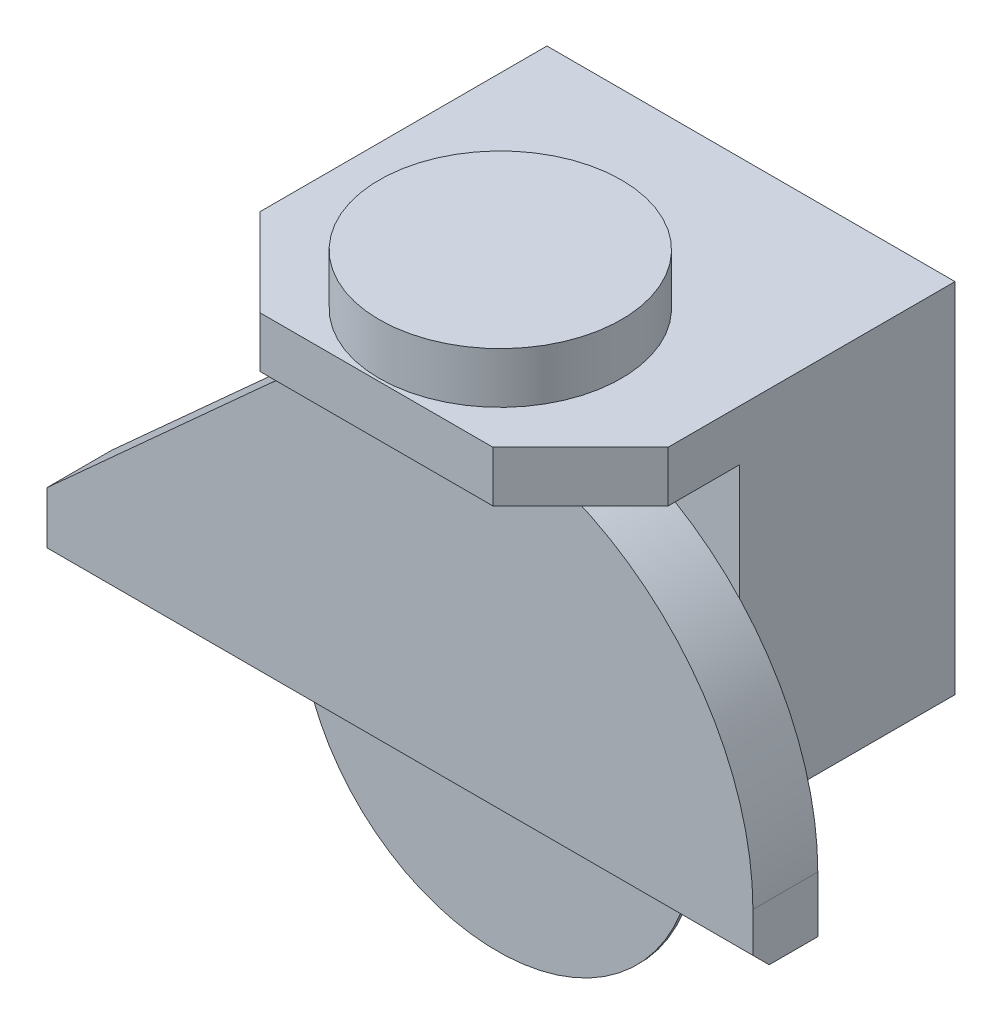
ISO-10303-21;
HEADER;
FILE_DESCRIPTION(('STEP AP214'),'2;1');
FILE_NAME('part.step','',(''),(''),'','','');
FILE_SCHEMA(('AUTOMOTIVE_DESIGN { 1 0 10303 214 1 1 1 1 }'));
ENDSEC;
DATA;
#1=APPLICATION_CONTEXT('core data for automotive mechanical design processes');
#2=APPLICATION_PROTOCOL_DEFINITION('international standard','automotive_design',2000,#1);
#3=PRODUCT_CONTEXT('',#1,'mechanical');
#4=PRODUCT('Part','Part','',(#3));
#5=PRODUCT_RELATED_PRODUCT_CATEGORY('part','',(#4));
#6=PRODUCT_DEFINITION_FORMATION('','',#4);
#7=PRODUCT_DEFINITION_CONTEXT('part definition',#1,'design');
#8=PRODUCT_DEFINITION('design','',#6,#7);
#9=PRODUCT_DEFINITION_SHAPE('','',#8);
#10=(LENGTH_UNIT() NAMED_UNIT(*) SI_UNIT(.MILLI.,.METRE.));
#11=(NAMED_UNIT(*) PLANE_ANGLE_UNIT() SI_UNIT($,.RADIAN.));
#12=(NAMED_UNIT(*) SI_UNIT($,.STERADIAN.) SOLID_ANGLE_UNIT());
#13=UNCERTAINTY_MEASURE_WITH_UNIT(LENGTH_MEASURE(1.E-05),#10,'distance_accuracy_value','');
#14=(GEOMETRIC_REPRESENTATION_CONTEXT(3) GLOBAL_UNCERTAINTY_ASSIGNED_CONTEXT((#13)) GLOBAL_UNIT_ASSIGNED_CONTEXT((#10,
#11,#12)) REPRESENTATION_CONTEXT('',''));
#15=CARTESIAN_POINT('',(0.,0.,0.));
#16=DIRECTION('',(0.,0.,1.));
#17=DIRECTION('',(1.,0.,0.));
#18=AXIS2_PLACEMENT_3D('',#15,#16,#17);
#19=CARTESIAN_POINT('',(0.,0.,-350.));
#20=DIRECTION('',(0.,0.,1.));
#21=DIRECTION('',(1.,0.,0.));
#22=AXIS2_PLACEMENT_3D('',#19,#20,#21);
#23=CYLINDRICAL_SURFACE('',#22,105.863842180841);
#24=CARTESIAN_POINT('',(0.,0.,-32.4999999999999));
#25=DIRECTION('',(0.,0.,1.));
#26=DIRECTION('',(1.,0.,0.));
#27=AXIS2_PLACEMENT_3D('',#24,#25,#26);
#28=CIRCLE('',#27,105.863842180841);
#29=CARTESIAN_POINT('',(84.3798817403787,-63.9311241788353,-32.4999999999999));
#30=VERTEX_POINT('',#29);
#31=CARTESIAN_POINT('',(-84.3798817403787,-63.9311241788353,-32.4999999999999));
#32=VERTEX_POINT('',#31);
#33=EDGE_CURVE('E313',#30,#32,#28,.T.);
#34=ORIENTED_EDGE('',*,*,#33,.F.);
#35=DIRECTION('',(0.,0.,1.));
#36=VECTOR('',#35,1.);
#37=CARTESIAN_POINT('',(84.3798817403787,-63.9311241788353,-350.));
#38=LINE('',#37,#36);
#39=CARTESIAN_POINT('',(84.3798817403787,-63.9311241788353,0.));
#40=VERTEX_POINT('',#39);
#41=EDGE_CURVE('E250',#30,#40,#38,.T.);
#42=ORIENTED_EDGE('',*,*,#41,.T.);
#43=CARTESIAN_POINT('',(0.,0.,0.));
#44=DIRECTION('',(0.,0.,-1.));
#45=DIRECTION('',(-1.,0.,0.));
#46=AXIS2_PLACEMENT_3D('',#43,#44,#45);
#47=CIRCLE('',#46,105.863842180841);
#48=CARTESIAN_POINT('',(-84.3798817403787,-63.9311241788353,0.));
#49=VERTEX_POINT('',#48);
#50=EDGE_CURVE('E291',#40,#49,#47,.T.);
#51=ORIENTED_EDGE('',*,*,#50,.T.);
#52=DIRECTION('',(0.,0.,1.));
#53=VECTOR('',#52,1.);
#54=CARTESIAN_POINT('',(-84.3798817403787,-63.9311241788353,-350.));
#55=LINE('',#54,#53);
#56=EDGE_CURVE('E258',#49,#32,#55,.F.);
#57=ORIENTED_EDGE('',*,*,#56,.T.);
#58=EDGE_LOOP('',(#34,#42,#51,#57));
#59=FACE_BOUND('',#58,.T.);
#60=CARTESIAN_POINT('',(0.,0.,-350.));
#61=DIRECTION('',(0.,0.,-1.));
#62=DIRECTION('',(-1.,0.,0.));
#63=AXIS2_PLACEMENT_3D('',#60,#61,#62);
#64=CIRCLE('',#63,105.863842180841);
#65=CARTESIAN_POINT('',(-105.863842180841,0.,-350.));
#66=VERTEX_POINT('',#65);
#67=EDGE_CURVE('E287',#66,#66,#64,.T.);
#68=ORIENTED_EDGE('',*,*,#67,.F.);
#69=EDGE_LOOP('',(#68));
#70=FACE_BOUND('',#69,.T.);
#71=DIRECTION('',(0.,0.,1.));
#72=VECTOR('',#71,1.);
#73=CARTESIAN_POINT('',(-105.863842180841,0.,-350.));
#74=LINE('',#73,#72);
#75=CARTESIAN_POINT('',(-105.863842180841,0.,-285.873317537533));
#76=VERTEX_POINT('',#75);
#77=CARTESIAN_POINT('',(-105.863842180841,0.,-39.836858515765));
#78=VERTEX_POINT('',#77);
#79=EDGE_CURVE('E308',#76,#78,#74,.T.);
#80=ORIENTED_EDGE('',*,*,#79,.F.);
#81=CARTESIAN_POINT('',(0.,0.,-285.873317537533));
#82=DIRECTION('',(0.,0.,1.));
#83=DIRECTION('',(1.,0.,0.));
#84=AXIS2_PLACEMENT_3D('',#81,#82,#83);
#85=CIRCLE('',#84,105.863842180841);
#86=CARTESIAN_POINT('',(105.863842180841,0.,-285.873317537533));
#87=VERTEX_POINT('',#86);
#88=EDGE_CURVE('E302',#87,#76,#85,.T.);
#89=ORIENTED_EDGE('',*,*,#88,.F.);
#90=DIRECTION('',(0.,0.,1.));
#91=VECTOR('',#90,1.);
#92=CARTESIAN_POINT('',(105.863842180841,0.,-350.));
#93=LINE('',#92,#91);
#94=CARTESIAN_POINT('',(105.863842180841,0.,-39.836858515765));
#95=VERTEX_POINT('',#94);
#96=EDGE_CURVE('E294',#95,#87,#93,.F.);
#97=ORIENTED_EDGE('',*,*,#96,.F.);
#98=CARTESIAN_POINT('',(0.,0.,-39.836858515765));
#99=DIRECTION('',(0.,0.,-1.));
#100=DIRECTION('',(-1.,0.,0.));
#101=AXIS2_PLACEMENT_3D('',#98,#99,#100);
#102=CIRCLE('',#101,105.863842180841);
#103=EDGE_CURVE('E305',#78,#95,#102,.T.);
#104=ORIENTED_EDGE('',*,*,#103,.F.);
#105=EDGE_LOOP('',(#80,#89,#97,#104));
#106=FACE_BOUND('',#105,.T.);
#107=ADVANCED_FACE('F33',(#59,#70,#106),#23,.T.);
#108=CARTESIAN_POINT('',(0.,0.,3.5));
#109=DIRECTION('',(0.,0.,-1.));
#110=DIRECTION('',(-1.,0.,0.));
#111=AXIS2_PLACEMENT_3D('',#108,#109,#110);
#112=CYLINDRICAL_SURFACE('',#111,225.);
#113=CARTESIAN_POINT('',(0.,0.,3.5));
#114=DIRECTION('',(0.,0.,1.));
#115=DIRECTION('',(1.,0.,0.));
#116=AXIS2_PLACEMENT_3D('',#113,#114,#115);
#117=CIRCLE('',#116,225.);
#118=CARTESIAN_POINT('',(-215.726241707471,-63.9311241788353,3.5));
#119=VERTEX_POINT('',#118);
#120=CARTESIAN_POINT('',(215.726241707471,-63.9311241788353,3.5));
#121=VERTEX_POINT('',#120);
#122=EDGE_CURVE('E295',#119,#121,#117,.T.);
#123=ORIENTED_EDGE('',*,*,#122,.F.);
#124=DIRECTION('',(0.,0.,-1.));
#125=VECTOR('',#124,1.);
#126=CARTESIAN_POINT('',(-215.726241707471,-63.9311241788353,3.5));
#127=LINE('',#126,#125);
#128=CARTESIAN_POINT('',(-215.726241707471,-63.9311241788353,0.));
#129=VERTEX_POINT('',#128);
#130=EDGE_CURVE('E255',#119,#129,#127,.T.);
#131=ORIENTED_EDGE('',*,*,#130,.T.);
#132=CARTESIAN_POINT('',(0.,0.,0.));
#133=DIRECTION('',(0.,0.,1.));
#134=DIRECTION('',(1.,0.,0.));
#135=AXIS2_PLACEMENT_3D('',#132,#133,#134);
#136=CIRCLE('',#135,225.);
#137=CARTESIAN_POINT('',(215.726241707471,-63.9311241788353,0.));
#138=VERTEX_POINT('',#137);
#139=EDGE_CURVE('E290',#129,#138,#136,.T.);
#140=ORIENTED_EDGE('',*,*,#139,.T.);
#141=DIRECTION('',(0.,0.,-1.));
#142=VECTOR('',#141,1.);
#143=CARTESIAN_POINT('',(215.726241707471,-63.9311241788353,3.5));
#144=LINE('',#143,#142);
#145=EDGE_CURVE('E57',#138,#121,#144,.F.);
#146=ORIENTED_EDGE('',*,*,#145,.T.);
#147=EDGE_LOOP('',(#123,#131,#140,#146));
#148=FACE_BOUND('',#147,.T.);
#149=ADVANCED_FACE('F35',(#148),#112,.T.);
#150=CARTESIAN_POINT('',(0.,0.,3.5));
#151=DIRECTION('',(0.,0.,1.));
#152=DIRECTION('',(1.,0.,0.));
#153=AXIS2_PLACEMENT_3D('',#150,#151,#152);
#154=PLANE('',#153);
#155=DIRECTION('',(1.,0.,0.));
#156=VECTOR('',#155,1.);
#157=CARTESIAN_POINT('',(0.,-63.9311241788353,3.5));
#158=LINE('',#157,#156);
#159=EDGE_CURVE('E253',#119,#121,#158,.T.);
#160=ORIENTED_EDGE('',*,*,#159,.F.);
#161=ORIENTED_EDGE('',*,*,#122,.T.);
#162=EDGE_LOOP('',(#160,#161));
#163=FACE_BOUND('',#162,.T.);
#164=ADVANCED_FACE('F365',(#163),#154,.T.);
#165=CARTESIAN_POINT('',(0.,0.,0.));
#166=DIRECTION('',(0.,0.,1.));
#167=DIRECTION('',(1.,0.,0.));
#168=AXIS2_PLACEMENT_3D('',#165,#166,#167);
#169=PLANE('',#168);
#170=ORIENTED_EDGE('',*,*,#139,.F.);
#171=DIRECTION('',(1.,0.,0.));
#172=VECTOR('',#171,1.);
#173=CARTESIAN_POINT('',(0.,-63.9311241788353,0.));
#174=LINE('',#173,#172);
#175=EDGE_CURVE('E312',#129,#49,#174,.T.);
#176=ORIENTED_EDGE('',*,*,#175,.T.);
#177=ORIENTED_EDGE('',*,*,#50,.F.);
#178=EDGE_CURVE('E311',#40,#138,#174,.T.);
#179=ORIENTED_EDGE('',*,*,#178,.T.);
#180=EDGE_LOOP('',(#170,#176,#177,#179));
#181=FACE_BOUND('',#180,.T.);
#182=ADVANCED_FACE('F322',(#181),#169,.F.);
#183=CARTESIAN_POINT('',(0.,0.,-350.));
#184=DIRECTION('',(0.,0.,-1.));
#185=DIRECTION('',(-1.,0.,0.));
#186=AXIS2_PLACEMENT_3D('',#183,#184,#185);
#187=PLANE('',#186);
#188=ORIENTED_EDGE('',*,*,#67,.T.);
#189=EDGE_LOOP('',(#188));
#190=FACE_BOUND('',#189,.T.);
#191=ADVANCED_FACE('F369',(#190),#187,.T.);
#192=CARTESIAN_POINT('',(0.,0.,0.));
#193=DIRECTION('',(0.,1.,0.));
#194=DIRECTION('',(0.,0.,1.));
#195=AXIS2_PLACEMENT_3D('',#192,#193,#194);
#196=PLANE('',#195);
#197=DIRECTION('',(-1.,0.,0.));
#198=VECTOR('',#197,1.);
#199=CARTESIAN_POINT('',(-232.685777197349,0.,-285.873317537533));
#200=LINE('',#199,#198);
#201=CARTESIAN_POINT('',(-232.685777197349,0.,-285.873317537533));
#202=VERTEX_POINT('',#201);
#203=EDGE_CURVE('E274',#76,#202,#200,.T.);
#204=ORIENTED_EDGE('',*,*,#203,.F.);
#205=ORIENTED_EDGE('',*,*,#79,.T.);
#206=DIRECTION('',(1.,0.,0.));
#207=VECTOR('',#206,1.);
#208=CARTESIAN_POINT('',(-232.685777197349,0.,-39.836858515765));
#209=LINE('',#208,#207);
#210=CARTESIAN_POINT('',(-232.685777197349,0.,-39.836858515765));
#211=VERTEX_POINT('',#210);
#212=EDGE_CURVE('E269',#211,#78,#209,.T.);
#213=ORIENTED_EDGE('',*,*,#212,.F.);
#214=DIRECTION('',(0.,0.,1.));
#215=VECTOR('',#214,1.);
#216=CARTESIAN_POINT('',(-232.685777197349,0.,-285.873317537533));
#217=LINE('',#216,#215);
#218=EDGE_CURVE('E261',#202,#211,#217,.T.);
#219=ORIENTED_EDGE('',*,*,#218,.F.);
#220=EDGE_LOOP('',(#204,#205,#213,#219));
#221=FACE_BOUND('',#220,.T.);
#222=ADVANCED_FACE('F377',(#221),#196,.F.);
#223=CARTESIAN_POINT('',(232.685777197349,0.,-39.836858515765));
#224=VERTEX_POINT('',#223);
#225=EDGE_CURVE('E268',#95,#224,#209,.T.);
#226=ORIENTED_EDGE('',*,*,#225,.F.);
#227=ORIENTED_EDGE('',*,*,#96,.T.);
#228=CARTESIAN_POINT('',(232.685777197349,0.,-285.873317537533));
#229=VERTEX_POINT('',#228);
#230=EDGE_CURVE('E266',#229,#87,#200,.T.);
#231=ORIENTED_EDGE('',*,*,#230,.F.);
#232=DIRECTION('',(0.,0.,-1.));
#233=VECTOR('',#232,1.);
#234=CARTESIAN_POINT('',(232.685777197349,0.,-285.873317537533));
#235=LINE('',#234,#233);
#236=EDGE_CURVE('E272',#224,#229,#235,.T.);
#237=ORIENTED_EDGE('',*,*,#236,.F.);
#238=EDGE_LOOP('',(#226,#227,#231,#237));
#239=FACE_BOUND('',#238,.T.);
#240=ADVANCED_FACE('F382',(#239),#196,.F.);
#241=CARTESIAN_POINT('',(-232.685777197349,350.,-285.873317537533));
#242=DIRECTION('',(1.,0.,0.));
#243=DIRECTION('',(0.,0.,-1.));
#244=AXIS2_PLACEMENT_3D('',#241,#242,#243);
#245=PLANE('',#244);
#246=ORIENTED_EDGE('',*,*,#218,.T.);
#247=DIRECTION('',(0.,-1.,0.));
#248=VECTOR('',#247,1.);
#249=CARTESIAN_POINT('',(-232.685777197349,350.,-39.836858515765));
#250=LINE('',#249,#248);
#251=CARTESIAN_POINT('',(-232.685777197349,350.,-39.836858515765));
#252=VERTEX_POINT('',#251);
#253=EDGE_CURVE('E284',#252,#211,#250,.T.);
#254=ORIENTED_EDGE('',*,*,#253,.F.);
#255=DIRECTION('',(0.,0.,1.));
#256=VECTOR('',#255,1.);
#257=CARTESIAN_POINT('',(-232.685777197349,350.,-285.873317537533));
#258=LINE('',#257,#256);
#259=CARTESIAN_POINT('',(-232.685777197349,350.,41.2304017052967));
#260=VERTEX_POINT('',#259);
#261=EDGE_CURVE('E197',#252,#260,#258,.T.);
#262=ORIENTED_EDGE('',*,*,#261,.T.);
#263=DIRECTION('',(0.,-1.,0.));
#264=VECTOR('',#263,1.);
#265=CARTESIAN_POINT('',(-232.685777197349,407.999999999999,41.2304017052967));
#266=LINE('',#265,#264);
#267=CARTESIAN_POINT('',(-232.685777197349,407.999999999999,41.2304017052967));
#268=VERTEX_POINT('',#267);
#269=EDGE_CURVE('E175',#268,#260,#266,.T.);
#270=ORIENTED_EDGE('',*,*,#269,.F.);
#271=DIRECTION('',(0.,0.,1.));
#272=VECTOR('',#271,1.);
#273=CARTESIAN_POINT('',(-232.685777197349,407.999999999999,-285.873317537533));
#274=LINE('',#273,#272);
#275=CARTESIAN_POINT('',(-232.685777197349,407.999999999999,-285.873317537533));
#276=VERTEX_POINT('',#275);
#277=EDGE_CURVE('E181',#276,#268,#274,.T.);
#278=ORIENTED_EDGE('',*,*,#277,.F.);
#279=DIRECTION('',(0.,-1.,0.));
#280=VECTOR('',#279,1.);
#281=CARTESIAN_POINT('',(-232.685777197349,350.,-285.873317537533));
#282=LINE('',#281,#280);
#283=EDGE_CURVE('E265',#276,#202,#282,.T.);
#284=ORIENTED_EDGE('',*,*,#283,.T.);
#285=EDGE_LOOP('',(#246,#254,#262,#270,#278,#284));
#286=FACE_BOUND('',#285,.T.);
#287=ADVANCED_FACE('F194',(#286),#245,.F.);
#288=CARTESIAN_POINT('',(-232.685777197349,350.,-39.836858515765));
#289=DIRECTION('',(0.,0.,-1.));
#290=DIRECTION('',(-1.,0.,0.));
#291=AXIS2_PLACEMENT_3D('',#288,#289,#290);
#292=PLANE('',#291);
#293=ORIENTED_EDGE('',*,*,#212,.T.);
#294=ORIENTED_EDGE('',*,*,#103,.T.);
#295=ORIENTED_EDGE('',*,*,#225,.T.);
#296=DIRECTION('',(0.,-1.,0.));
#297=VECTOR('',#296,1.);
#298=CARTESIAN_POINT('',(232.685777197349,350.,-39.836858515765));
#299=LINE('',#298,#297);
#300=CARTESIAN_POINT('',(232.685777197349,350.,-39.836858515765));
#301=VERTEX_POINT('',#300);
#302=EDGE_CURVE('E281',#301,#224,#299,.T.);
#303=ORIENTED_EDGE('',*,*,#302,.F.);
#304=DIRECTION('',(1.,0.,0.));
#305=VECTOR('',#304,1.);
#306=CARTESIAN_POINT('',(-232.685777197349,350.,-39.836858515765));
#307=LINE('',#306,#305);
#308=EDGE_CURVE('E262',#252,#301,#307,.T.);
#309=ORIENTED_EDGE('',*,*,#308,.F.);
#310=ORIENTED_EDGE('',*,*,#253,.T.);
#311=EDGE_LOOP('',(#293,#294,#295,#303,#309,#310));
#312=FACE_BOUND('',#311,.T.);
#313=ADVANCED_FACE('F507',(#312),#292,.F.);
#314=CARTESIAN_POINT('',(232.685777197349,350.,-285.873317537533));
#315=DIRECTION('',(-1.,0.,0.));
#316=DIRECTION('',(0.,0.,1.));
#317=AXIS2_PLACEMENT_3D('',#314,#315,#316);
#318=PLANE('',#317);
#319=ORIENTED_EDGE('',*,*,#236,.T.);
#320=DIRECTION('',(0.,-1.,0.));
#321=VECTOR('',#320,1.);
#322=CARTESIAN_POINT('',(232.685777197349,350.,-285.873317537533));
#323=LINE('',#322,#321);
#324=CARTESIAN_POINT('',(232.685777197349,407.999999999999,-285.873317537533));
#325=VERTEX_POINT('',#324);
#326=EDGE_CURVE('E278',#325,#229,#323,.T.);
#327=ORIENTED_EDGE('',*,*,#326,.F.);
#328=DIRECTION('',(0.,0.,-1.));
#329=VECTOR('',#328,1.);
#330=CARTESIAN_POINT('',(232.685777197349,407.999999999999,-285.873317537533));
#331=LINE('',#330,#329);
#332=CARTESIAN_POINT('',(232.685777197349,407.999999999999,41.2304017052967));
#333=VERTEX_POINT('',#332);
#334=EDGE_CURVE('E393',#333,#325,#331,.T.);
#335=ORIENTED_EDGE('',*,*,#334,.F.);
#336=DIRECTION('',(0.,-1.,0.));
#337=VECTOR('',#336,1.);
#338=CARTESIAN_POINT('',(232.685777197349,407.999999999999,41.2304017052967));
#339=LINE('',#338,#337);
#340=CARTESIAN_POINT('',(232.685777197349,350.,41.2304017052967));
#341=VERTEX_POINT('',#340);
#342=EDGE_CURVE('E392',#333,#341,#339,.T.);
#343=ORIENTED_EDGE('',*,*,#342,.T.);
#344=DIRECTION('',(0.,0.,-1.));
#345=VECTOR('',#344,1.);
#346=CARTESIAN_POINT('',(232.685777197349,350.,-285.873317537533));
#347=LINE('',#346,#345);
#348=EDGE_CURVE('E191',#341,#301,#347,.T.);
#349=ORIENTED_EDGE('',*,*,#348,.T.);
#350=ORIENTED_EDGE('',*,*,#302,.T.);
#351=EDGE_LOOP('',(#319,#327,#335,#343,#349,#350));
#352=FACE_BOUND('',#351,.T.);
#353=ADVANCED_FACE('F421',(#352),#318,.F.);
#354=CARTESIAN_POINT('',(-232.685777197349,350.,-285.873317537533));
#355=DIRECTION('',(0.,0.,1.));
#356=DIRECTION('',(1.,0.,0.));
#357=AXIS2_PLACEMENT_3D('',#354,#355,#356);
#358=PLANE('',#357);
#359=ORIENTED_EDGE('',*,*,#230,.T.);
#360=ORIENTED_EDGE('',*,*,#88,.T.);
#361=ORIENTED_EDGE('',*,*,#203,.T.);
#362=ORIENTED_EDGE('',*,*,#283,.F.);
#363=DIRECTION('',(-1.,0.,0.));
#364=VECTOR('',#363,1.);
#365=CARTESIAN_POINT('',(-232.685777197349,407.999999999999,-285.873317537533));
#366=LINE('',#365,#364);
#367=EDGE_CURVE('E188',#325,#276,#366,.T.);
#368=ORIENTED_EDGE('',*,*,#367,.F.);
#369=ORIENTED_EDGE('',*,*,#326,.T.);
#370=EDGE_LOOP('',(#359,#360,#361,#362,#368,#369));
#371=FACE_BOUND('',#370,.T.);
#372=ADVANCED_FACE('F389',(#371),#358,.F.);
#373=CARTESIAN_POINT('',(-475.524623773399,-63.9311241788353,-32.4999999999999));
#374=DIRECTION('',(0.,-1.,0.));
#375=DIRECTION('',(0.,0.,-1.));
#376=AXIS2_PLACEMENT_3D('',#373,#374,#375);
#377=PLANE('',#376);
#378=DIRECTION('',(1.,0.,0.));
#379=VECTOR('',#378,1.);
#380=CARTESIAN_POINT('',(-681.433400101649,-63.9311241788353,22.965629145663));
#381=LINE('',#380,#379);
#382=CARTESIAN_POINT('',(-475.524623773399,-63.9311241788353,22.965629145663));
#383=VERTEX_POINT('',#382);
#384=CARTESIAN_POINT('',(329.56659989835,-63.9311241788353,22.965629145663));
#385=VERTEX_POINT('',#384);
#386=EDGE_CURVE('E200',#383,#385,#381,.T.);
#387=ORIENTED_EDGE('',*,*,#386,.F.);
#388=DIRECTION('',(0.,0.,1.));
#389=VECTOR('',#388,1.);
#390=CARTESIAN_POINT('',(-475.524623773399,-63.9311241788353,-32.4999999999999));
#391=LINE('',#390,#389);
#392=CARTESIAN_POINT('',(-475.524623773399,-63.9311241788353,-32.4999999999999));
#393=VERTEX_POINT('',#392);
#394=EDGE_CURVE('E236',#393,#383,#391,.T.);
#395=ORIENTED_EDGE('',*,*,#394,.F.);
#396=DIRECTION('',(1.,0.,0.));
#397=VECTOR('',#396,1.);
#398=CARTESIAN_POINT('',(-475.524623773399,-63.9311241788353,-32.4999999999999));
#399=LINE('',#398,#397);
#400=EDGE_CURVE('E224',#393,#32,#399,.T.);
#401=ORIENTED_EDGE('',*,*,#400,.T.);
#402=ORIENTED_EDGE('',*,*,#56,.F.);
#403=ORIENTED_EDGE('',*,*,#175,.F.);
#404=ORIENTED_EDGE('',*,*,#130,.F.);
#405=ORIENTED_EDGE('',*,*,#159,.T.);
#406=ORIENTED_EDGE('',*,*,#145,.F.);
#407=ORIENTED_EDGE('',*,*,#178,.F.);
#408=ORIENTED_EDGE('',*,*,#41,.F.);
#409=CARTESIAN_POINT('',(329.56659989835,-63.9311241788353,-32.4999999999999));
#410=VERTEX_POINT('',#409);
#411=EDGE_CURVE('E223',#30,#410,#399,.T.);
#412=ORIENTED_EDGE('',*,*,#411,.T.);
#413=DIRECTION('',(0.,0.,1.));
#414=VECTOR('',#413,1.);
#415=CARTESIAN_POINT('',(329.56659989835,-63.9311241788353,-32.4999999999999));
#416=LINE('',#415,#414);
#417=EDGE_CURVE('E244',#410,#385,#416,.T.);
#418=ORIENTED_EDGE('',*,*,#417,.T.);
#419=EDGE_LOOP('',(#387,#395,#401,#402,#403,#404,#405,#406,#407,#408,#412,#418));
#420=FACE_BOUND('',#419,.T.);
#421=ADVANCED_FACE('F326',(#420),#377,.T.);
#422=CARTESIAN_POINT('',(-475.524623773399,-63.9311241788353,-32.4999999999999));
#423=DIRECTION('',(-1.,0.,0.));
#424=DIRECTION('',(0.,0.,1.));
#425=AXIS2_PLACEMENT_3D('',#422,#423,#424);
#426=PLANE('',#425);
#427=DIRECTION('',(0.,-0.707106781186547,-0.707106781186547));
#428=VECTOR('',#427,1.);
#429=CARTESIAN_POINT('',(-475.524623773399,-91.6639387516668,-4.76718542716846));
#430=LINE('',#429,#428);
#431=CARTESIAN_POINT('',(-475.524623773399,-45.3967533244984,41.4999999999999));
#432=VERTEX_POINT('',#431);
#433=EDGE_CURVE('E207',#432,#383,#430,.T.);
#434=ORIENTED_EDGE('',*,*,#433,.F.);
#435=DIRECTION('',(0.,-1.,0.));
#436=VECTOR('',#435,1.);
#437=CARTESIAN_POINT('',(-475.524623773399,-63.9311241788353,41.4999999999999));
#438=LINE('',#437,#436);
#439=CARTESIAN_POINT('',(-475.524623773399,14.1296526308758,41.4999999999999));
#440=VERTEX_POINT('',#439);
#441=EDGE_CURVE('E209',#440,#432,#438,.T.);
#442=ORIENTED_EDGE('',*,*,#441,.F.);
#443=DIRECTION('',(0.,0.,1.));
#444=VECTOR('',#443,1.);
#445=CARTESIAN_POINT('',(-475.524623773399,14.1296526308758,-32.4999999999999));
#446=LINE('',#445,#444);
#447=CARTESIAN_POINT('',(-475.524623773399,14.1296526308758,-32.4999999999999));
#448=VERTEX_POINT('',#447);
#449=EDGE_CURVE('E237',#448,#440,#446,.T.);
#450=ORIENTED_EDGE('',*,*,#449,.F.);
#451=DIRECTION('',(0.,-1.,0.));
#452=VECTOR('',#451,1.);
#453=CARTESIAN_POINT('',(-475.524623773399,-63.9311241788353,-32.4999999999999));
#454=LINE('',#453,#452);
#455=EDGE_CURVE('E220',#448,#393,#454,.T.);
#456=ORIENTED_EDGE('',*,*,#455,.T.);
#457=ORIENTED_EDGE('',*,*,#394,.T.);
#458=EDGE_LOOP('',(#434,#442,#450,#456,#457));
#459=FACE_BOUND('',#458,.T.);
#460=ADVANCED_FACE('F338',(#459),#426,.T.);
#461=CARTESIAN_POINT('',(-475.524623773399,14.1296526308758,-32.4999999999999));
#462=DIRECTION('',(-0.671028185694238,0.741431840430325,0.));
#463=DIRECTION('',(-0.741431840430325,-0.671028185694238,0.));
#464=AXIS2_PLACEMENT_3D('',#461,#462,#463);
#465=PLANE('',#464);
#466=ORIENTED_EDGE('',*,*,#449,.T.);
#467=DIRECTION('',(-0.741431840430325,-0.671028185694238,0.));
#468=VECTOR('',#467,1.);
#469=CARTESIAN_POINT('',(-475.524623773399,14.1296526308758,41.4999999999999));
#470=LINE('',#469,#468);
#471=CARTESIAN_POINT('',(-221.148477595209,244.351170706999,41.4999999999999));
#472=VERTEX_POINT('',#471);
#473=EDGE_CURVE('E217',#472,#440,#470,.T.);
#474=ORIENTED_EDGE('',*,*,#473,.F.);
#475=DIRECTION('',(0.,0.,1.));
#476=VECTOR('',#475,1.);
#477=CARTESIAN_POINT('',(-221.148477595209,244.351170706999,-32.4999999999999));
#478=LINE('',#477,#476);
#479=CARTESIAN_POINT('',(-221.148477595209,244.351170706999,-32.4999999999999));
#480=VERTEX_POINT('',#479);
#481=EDGE_CURVE('E239',#480,#472,#478,.T.);
#482=ORIENTED_EDGE('',*,*,#481,.F.);
#483=DIRECTION('',(-0.741431840430325,-0.671028185694238,0.));
#484=VECTOR('',#483,1.);
#485=CARTESIAN_POINT('',(-475.524623773399,14.1296526308758,-32.4999999999999));
#486=LINE('',#485,#484);
#487=EDGE_CURVE('E233',#480,#448,#486,.T.);
#488=ORIENTED_EDGE('',*,*,#487,.T.);
#489=EDGE_LOOP('',(#466,#474,#482,#488));
#490=FACE_BOUND('',#489,.T.);
#491=ADVANCED_FACE('F342',(#490),#465,.T.);
#492=CARTESIAN_POINT('',(0.,0.,-32.4999999999999));
#493=DIRECTION('',(0.,0.,1.));
#494=DIRECTION('',(1.,0.,0.));
#495=AXIS2_PLACEMENT_3D('',#492,#493,#494);
#496=CYLINDRICAL_SURFACE('',#495,329.56659989835);
#497=ORIENTED_EDGE('',*,*,#481,.T.);
#498=CARTESIAN_POINT('',(0.,0.,41.4999999999999));
#499=DIRECTION('',(0.,0.,1.));
#500=DIRECTION('',(1.,0.,0.));
#501=AXIS2_PLACEMENT_3D('',#498,#499,#500);
#502=CIRCLE('',#501,329.56659989835);
#503=CARTESIAN_POINT('',(329.56659989835,0.,41.4999999999999));
#504=VERTEX_POINT('',#503);
#505=EDGE_CURVE('E214',#504,#472,#502,.T.);
#506=ORIENTED_EDGE('',*,*,#505,.F.);
#507=DIRECTION('',(0.,0.,1.));
#508=VECTOR('',#507,1.);
#509=CARTESIAN_POINT('',(329.56659989835,0.,-32.4999999999999));
#510=LINE('',#509,#508);
#511=CARTESIAN_POINT('',(329.56659989835,0.,-32.4999999999999));
#512=VERTEX_POINT('',#511);
#513=EDGE_CURVE('E241',#512,#504,#510,.T.);
#514=ORIENTED_EDGE('',*,*,#513,.F.);
#515=CARTESIAN_POINT('',(0.,0.,-32.4999999999999));
#516=DIRECTION('',(0.,0.,1.));
#517=DIRECTION('',(1.,0.,0.));
#518=AXIS2_PLACEMENT_3D('',#515,#516,#517);
#519=CIRCLE('',#518,329.56659989835);
#520=EDGE_CURVE('E230',#512,#480,#519,.T.);
#521=ORIENTED_EDGE('',*,*,#520,.T.);
#522=EDGE_LOOP('',(#497,#506,#514,#521));
#523=FACE_BOUND('',#522,.T.);
#524=ADVANCED_FACE('F345',(#523),#496,.T.);
#525=CARTESIAN_POINT('',(329.56659989835,0.,-32.4999999999999));
#526=DIRECTION('',(1.,0.,0.));
#527=DIRECTION('',(0.,0.,-1.));
#528=AXIS2_PLACEMENT_3D('',#525,#526,#527);
#529=PLANE('',#528);
#530=DIRECTION('',(0.,0.707106781186548,0.707106781186548));
#531=VECTOR('',#530,1.);
#532=CARTESIAN_POINT('',(329.56659989835,-45.3967533244984,41.4999999999999));
#533=LINE('',#532,#531);
#534=CARTESIAN_POINT('',(329.56659989835,-45.3967533244984,41.4999999999999));
#535=VERTEX_POINT('',#534);
#536=EDGE_CURVE('E49',#385,#535,#533,.T.);
#537=ORIENTED_EDGE('',*,*,#536,.F.);
#538=ORIENTED_EDGE('',*,*,#417,.F.);
#539=DIRECTION('',(0.,1.,0.));
#540=VECTOR('',#539,1.);
#541=CARTESIAN_POINT('',(329.56659989835,0.,-32.4999999999999));
#542=LINE('',#541,#540);
#543=EDGE_CURVE('E227',#410,#512,#542,.T.);
#544=ORIENTED_EDGE('',*,*,#543,.T.);
#545=ORIENTED_EDGE('',*,*,#513,.T.);
#546=DIRECTION('',(0.,1.,0.));
#547=VECTOR('',#546,1.);
#548=CARTESIAN_POINT('',(329.56659989835,0.,41.4999999999999));
#549=LINE('',#548,#547);
#550=EDGE_CURVE('E212',#535,#504,#549,.T.);
#551=ORIENTED_EDGE('',*,*,#550,.F.);
#552=EDGE_LOOP('',(#537,#538,#544,#545,#551));
#553=FACE_BOUND('',#552,.T.);
#554=ADVANCED_FACE('F333',(#553),#529,.T.);
#555=CARTESIAN_POINT('',(0.,0.,-32.4999999999999));
#556=DIRECTION('',(0.,0.,1.));
#557=DIRECTION('',(1.,0.,0.));
#558=AXIS2_PLACEMENT_3D('',#555,#556,#557);
#559=PLANE('',#558);
#560=ORIENTED_EDGE('',*,*,#411,.F.);
#561=ORIENTED_EDGE('',*,*,#33,.T.);
#562=ORIENTED_EDGE('',*,*,#400,.F.);
#563=ORIENTED_EDGE('',*,*,#455,.F.);
#564=ORIENTED_EDGE('',*,*,#487,.F.);
#565=ORIENTED_EDGE('',*,*,#520,.F.);
#566=ORIENTED_EDGE('',*,*,#543,.F.);
#567=EDGE_LOOP('',(#560,#561,#562,#563,#564,#565,#566));
#568=FACE_BOUND('',#567,.T.);
#569=ADVANCED_FACE('F329',(#568),#559,.F.);
#570=CARTESIAN_POINT('',(0.,0.,41.4999999999999));
#571=DIRECTION('',(0.,0.,1.));
#572=DIRECTION('',(1.,0.,0.));
#573=AXIS2_PLACEMENT_3D('',#570,#571,#572);
#574=PLANE('',#573);
#575=DIRECTION('',(-1.,0.,0.));
#576=VECTOR('',#575,1.);
#577=CARTESIAN_POINT('',(0.,-45.3967533244984,41.4999999999999));
#578=LINE('',#577,#576);
#579=EDGE_CURVE('E37',#535,#432,#578,.T.);
#580=ORIENTED_EDGE('',*,*,#579,.F.);
#581=ORIENTED_EDGE('',*,*,#550,.T.);
#582=ORIENTED_EDGE('',*,*,#505,.T.);
#583=ORIENTED_EDGE('',*,*,#473,.T.);
#584=ORIENTED_EDGE('',*,*,#441,.T.);
#585=EDGE_LOOP('',(#580,#581,#582,#583,#584));
#586=FACE_BOUND('',#585,.T.);
#587=ADVANCED_FACE('F347',(#586),#574,.T.);
#588=CARTESIAN_POINT('',(-681.433400101649,-45.3967533244984,41.4999999999999));
#589=DIRECTION('',(0.,0.707106781186547,-0.707106781186547));
#590=DIRECTION('',(0.,0.707106781186548,0.707106781186548));
#591=AXIS2_PLACEMENT_3D('',#588,#589,#590);
#592=PLANE('',#591);
#593=ORIENTED_EDGE('',*,*,#433,.T.);
#594=ORIENTED_EDGE('',*,*,#386,.T.);
#595=ORIENTED_EDGE('',*,*,#536,.T.);
#596=ORIENTED_EDGE('',*,*,#579,.T.);
#597=EDGE_LOOP('',(#593,#594,#595,#596));
#598=FACE_BOUND('',#597,.T.);
#599=ADVANCED_FACE('F348',(#598),#592,.F.);
#600=CARTESIAN_POINT('',(0.,350.,0.));
#601=DIRECTION('',(0.,1.,0.));
#602=DIRECTION('',(0.,0.,1.));
#603=AXIS2_PLACEMENT_3D('',#600,#601,#602);
#604=PLANE('',#603);
#605=ORIENTED_EDGE('',*,*,#261,.F.);
#606=ORIENTED_EDGE('',*,*,#308,.T.);
#607=ORIENTED_EDGE('',*,*,#348,.F.);
#608=DIRECTION('',(0.707106781186547,0.,-0.707106781186547));
#609=VECTOR('',#608,1.);
#610=CARTESIAN_POINT('',(132.685777197349,350.,141.230401705297));
#611=LINE('',#610,#609);
#612=CARTESIAN_POINT('',(132.685777197349,350.,141.230401705297));
#613=VERTEX_POINT('',#612);
#614=EDGE_CURVE('E407',#613,#341,#611,.T.);
#615=ORIENTED_EDGE('',*,*,#614,.F.);
#616=DIRECTION('',(1.,0.,0.));
#617=VECTOR('',#616,1.);
#618=CARTESIAN_POINT('',(-132.685777197349,350.,141.230401705297));
#619=LINE('',#618,#617);
#620=CARTESIAN_POINT('',(-132.685777197349,350.,141.230401705297));
#621=VERTEX_POINT('',#620);
#622=EDGE_CURVE('E405',#621,#613,#619,.T.);
#623=ORIENTED_EDGE('',*,*,#622,.F.);
#624=DIRECTION('',(0.707106781186547,0.,0.707106781186547));
#625=VECTOR('',#624,1.);
#626=CARTESIAN_POINT('',(-232.685777197349,350.,41.2304017052967));
#627=LINE('',#626,#625);
#628=EDGE_CURVE('E402',#260,#621,#627,.T.);
#629=ORIENTED_EDGE('',*,*,#628,.F.);
#630=EDGE_LOOP('',(#605,#606,#607,#615,#623,#629));
#631=FACE_BOUND('',#630,.T.);
#632=ADVANCED_FACE('F350',(#631),#604,.F.);
#633=CARTESIAN_POINT('',(-232.685777197349,407.999999999999,41.2304017052967));
#634=DIRECTION('',(0.707106781186547,0.,-0.707106781186547));
#635=DIRECTION('',(-0.707106781186548,0.,-0.707106781186548));
#636=AXIS2_PLACEMENT_3D('',#633,#634,#635);
#637=PLANE('',#636);
#638=ORIENTED_EDGE('',*,*,#628,.T.);
#639=DIRECTION('',(0.,-1.,0.));
#640=VECTOR('',#639,1.);
#641=CARTESIAN_POINT('',(-132.685777197349,407.999999999999,141.230401705297));
#642=LINE('',#641,#640);
#643=CARTESIAN_POINT('',(-132.685777197349,407.999999999999,141.230401705297));
#644=VERTEX_POINT('',#643);
#645=EDGE_CURVE('E177',#644,#621,#642,.T.);
#646=ORIENTED_EDGE('',*,*,#645,.F.);
#647=DIRECTION('',(0.707106781186547,0.,0.707106781186547));
#648=VECTOR('',#647,1.);
#649=CARTESIAN_POINT('',(-232.685777197349,407.999999999999,41.2304017052967));
#650=LINE('',#649,#648);
#651=EDGE_CURVE('E171',#268,#644,#650,.T.);
#652=ORIENTED_EDGE('',*,*,#651,.F.);
#653=ORIENTED_EDGE('',*,*,#269,.T.);
#654=EDGE_LOOP('',(#638,#646,#652,#653));
#655=FACE_BOUND('',#654,.T.);
#656=ADVANCED_FACE('F173',(#655),#637,.F.);
#657=CARTESIAN_POINT('',(-132.685777197349,407.999999999999,141.230401705297));
#658=DIRECTION('',(0.,0.,-1.));
#659=DIRECTION('',(-1.,0.,0.));
#660=AXIS2_PLACEMENT_3D('',#657,#658,#659);
#661=PLANE('',#660);
#662=ORIENTED_EDGE('',*,*,#622,.T.);
#663=DIRECTION('',(0.,-1.,0.));
#664=VECTOR('',#663,1.);
#665=CARTESIAN_POINT('',(132.685777197349,407.999999999999,141.230401705297));
#666=LINE('',#665,#664);
#667=CARTESIAN_POINT('',(132.685777197349,407.999999999999,141.230401705297));
#668=VERTEX_POINT('',#667);
#669=EDGE_CURVE('E202',#668,#613,#666,.T.);
#670=ORIENTED_EDGE('',*,*,#669,.F.);
#671=DIRECTION('',(1.,0.,0.));
#672=VECTOR('',#671,1.);
#673=CARTESIAN_POINT('',(-132.685777197349,407.999999999999,141.230401705297));
#674=LINE('',#673,#672);
#675=EDGE_CURVE('E180',#644,#668,#674,.T.);
#676=ORIENTED_EDGE('',*,*,#675,.F.);
#677=ORIENTED_EDGE('',*,*,#645,.T.);
#678=EDGE_LOOP('',(#662,#670,#676,#677));
#679=FACE_BOUND('',#678,.T.);
#680=ADVANCED_FACE('F442',(#679),#661,.F.);
#681=CARTESIAN_POINT('',(132.685777197349,407.999999999999,141.230401705297));
#682=DIRECTION('',(-0.707106781186547,0.,-0.707106781186547));
#683=DIRECTION('',(-0.707106781186548,0.,0.707106781186548));
#684=AXIS2_PLACEMENT_3D('',#681,#682,#683);
#685=PLANE('',#684);
#686=ORIENTED_EDGE('',*,*,#614,.T.);
#687=ORIENTED_EDGE('',*,*,#342,.F.);
#688=DIRECTION('',(0.707106781186547,0.,-0.707106781186547));
#689=VECTOR('',#688,1.);
#690=CARTESIAN_POINT('',(132.685777197349,407.999999999999,141.230401705297));
#691=LINE('',#690,#689);
#692=EDGE_CURVE('E397',#668,#333,#691,.T.);
#693=ORIENTED_EDGE('',*,*,#692,.F.);
#694=ORIENTED_EDGE('',*,*,#669,.T.);
#695=EDGE_LOOP('',(#686,#687,#693,#694));
#696=FACE_BOUND('',#695,.T.);
#697=ADVANCED_FACE('F415',(#696),#685,.F.);
#698=CARTESIAN_POINT('',(0.,407.999999999999,0.));
#699=DIRECTION('',(0.,1.,0.));
#700=DIRECTION('',(0.,0.,1.));
#701=AXIS2_PLACEMENT_3D('',#698,#699,#700);
#702=PLANE('',#701);
#703=CARTESIAN_POINT('',(0.,407.999999999999,0.));
#704=DIRECTION('',(0.,1.,0.));
#705=DIRECTION('',(0.,0.,1.));
#706=AXIS2_PLACEMENT_3D('',#703,#704,#705);
#707=CIRCLE('',#706,138.083103166593);
#708=CARTESIAN_POINT('',(0.,407.999999999999,138.083103166593));
#709=VERTEX_POINT('',#708);
#710=EDGE_CURVE('E11',#709,#709,#707,.T.);
#711=ORIENTED_EDGE('',*,*,#710,.F.);
#712=EDGE_LOOP('',(#711));
#713=FACE_BOUND('',#712,.T.);
#714=ORIENTED_EDGE('',*,*,#277,.T.);
#715=ORIENTED_EDGE('',*,*,#651,.T.);
#716=ORIENTED_EDGE('',*,*,#675,.T.);
#717=ORIENTED_EDGE('',*,*,#692,.T.);
#718=ORIENTED_EDGE('',*,*,#334,.T.);
#719=ORIENTED_EDGE('',*,*,#367,.T.);
#720=EDGE_LOOP('',(#714,#715,#716,#717,#718,#719));
#721=FACE_BOUND('',#720,.T.);
#722=ADVANCED_FACE('F185',(#713,#721),#702,.T.);
#723=CARTESIAN_POINT('',(0.,465.999999999999,0.));
#724=DIRECTION('',(0.,-1.,0.));
#725=DIRECTION('',(0.,0.,-1.));
#726=AXIS2_PLACEMENT_3D('',#723,#724,#725);
#727=CYLINDRICAL_SURFACE('',#726,138.083103166593);
#728=CARTESIAN_POINT('',(0.,465.999999999999,0.));
#729=DIRECTION('',(0.,1.,0.));
#730=DIRECTION('',(0.,0.,1.));
#731=AXIS2_PLACEMENT_3D('',#728,#729,#730);
#732=CIRCLE('',#731,138.083103166593);
#733=CARTESIAN_POINT('',(0.,465.999999999999,138.083103166593));
#734=VERTEX_POINT('',#733);
#735=EDGE_CURVE('E403',#734,#734,#732,.T.);
#736=ORIENTED_EDGE('',*,*,#735,.F.);
#737=EDGE_LOOP('',(#736));
#738=FACE_BOUND('',#737,.T.);
#739=ORIENTED_EDGE('',*,*,#710,.T.);
#740=EDGE_LOOP('',(#739));
#741=FACE_BOUND('',#740,.T.);
#742=ADVANCED_FACE('F431',(#738,#741),#727,.T.);
#743=CARTESIAN_POINT('',(0.,465.999999999999,0.));
#744=DIRECTION('',(0.,1.,0.));
#745=DIRECTION('',(0.,0.,1.));
#746=AXIS2_PLACEMENT_3D('',#743,#744,#745);
#747=PLANE('',#746);
#748=ORIENTED_EDGE('',*,*,#735,.T.);
#749=EDGE_LOOP('',(#748));
#750=FACE_BOUND('',#749,.T.);
#751=ADVANCED_FACE('F429',(#750),#747,.T.);
#752=CLOSED_SHELL('',(#107,#149,#164,#182,#191,#222,#240,#287,#313,#353,#372,#421,#460,#491,
#524,#554,#569,#587,#599,#632,#656,#680,#697,#722,#742,#751));
#753=MANIFOLD_SOLID_BREP('B2',#752);
#754=ADVANCED_BREP_SHAPE_REPRESENTATION('',(#18,#753),#14);
#755=SHAPE_DEFINITION_REPRESENTATION(#9,#754);
ENDSEC;
END-ISO-10303-21;
